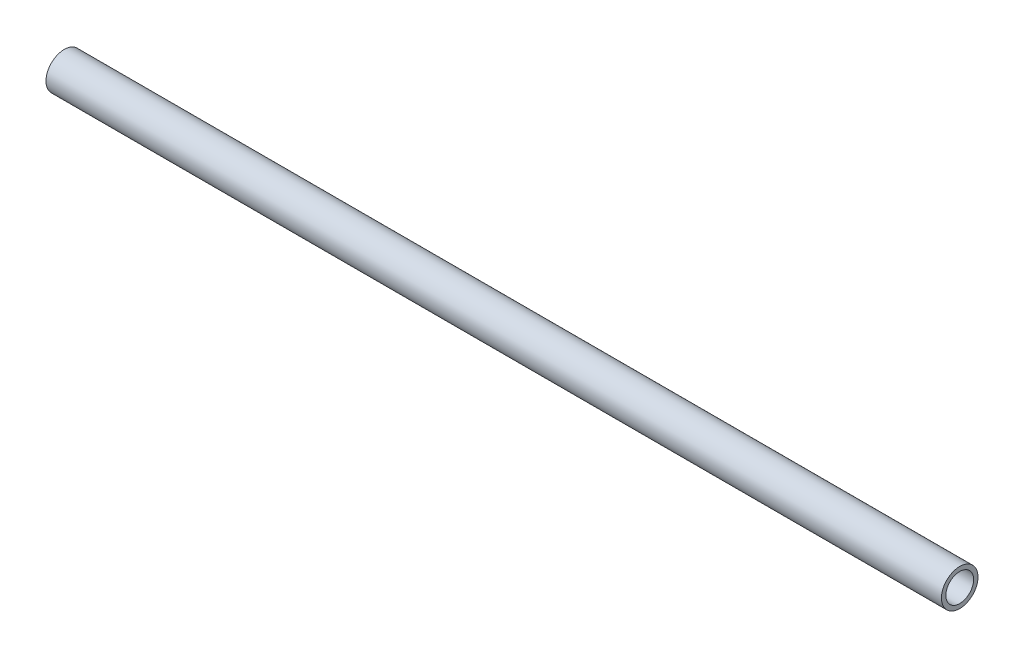
ISO-10303-21;
HEADER;
FILE_DESCRIPTION(('STEP AP214'),'2;1');
FILE_NAME('part.step','',(''),(''),'','','');
FILE_SCHEMA(('AUTOMOTIVE_DESIGN { 1 0 10303 214 1 1 1 1 }'));
ENDSEC;
DATA;
#1=APPLICATION_CONTEXT('core data for automotive mechanical design processes');
#2=APPLICATION_PROTOCOL_DEFINITION('international standard','automotive_design',2000,#1);
#3=PRODUCT_CONTEXT('',#1,'mechanical');
#4=PRODUCT('Part','Part','',(#3));
#5=PRODUCT_RELATED_PRODUCT_CATEGORY('part','',(#4));
#6=PRODUCT_DEFINITION_FORMATION('','',#4);
#7=PRODUCT_DEFINITION_CONTEXT('part definition',#1,'design');
#8=PRODUCT_DEFINITION('design','',#6,#7);
#9=PRODUCT_DEFINITION_SHAPE('','',#8);
#10=(LENGTH_UNIT() NAMED_UNIT(*) SI_UNIT(.MILLI.,.METRE.));
#11=(NAMED_UNIT(*) PLANE_ANGLE_UNIT() SI_UNIT($,.RADIAN.));
#12=(NAMED_UNIT(*) SI_UNIT($,.STERADIAN.) SOLID_ANGLE_UNIT());
#13=UNCERTAINTY_MEASURE_WITH_UNIT(LENGTH_MEASURE(1.E-05),#10,'distance_accuracy_value','');
#14=(GEOMETRIC_REPRESENTATION_CONTEXT(3) GLOBAL_UNCERTAINTY_ASSIGNED_CONTEXT((#13)) GLOBAL_UNIT_ASSIGNED_CONTEXT((#10,
#11,#12)) REPRESENTATION_CONTEXT('',''));
#15=CARTESIAN_POINT('',(0.,0.,0.));
#16=DIRECTION('',(0.,0.,1.));
#17=DIRECTION('',(1.,0.,0.));
#18=AXIS2_PLACEMENT_3D('',#15,#16,#17);
#19=CARTESIAN_POINT('',(622.3,0.,0.));
#20=DIRECTION('',(1.,0.,0.));
#21=DIRECTION('',(0.,0.,-1.));
#22=AXIS2_PLACEMENT_3D('',#19,#20,#21);
#23=PLANE('',#22);
#24=CARTESIAN_POINT('',(622.3,0.,0.));
#25=DIRECTION('',(1.,0.,0.));
#26=DIRECTION('',(0.,0.,-1.));
#27=AXIS2_PLACEMENT_3D('',#24,#25,#26);
#28=CIRCLE('',#27,12.7);
#29=CARTESIAN_POINT('',(622.3,0.,-12.7));
#30=VERTEX_POINT('',#29);
#31=EDGE_CURVE('E10',#30,#30,#28,.T.);
#32=ORIENTED_EDGE('',*,*,#31,.T.);
#33=EDGE_LOOP('',(#32));
#34=FACE_BOUND('',#33,.T.);
#35=CARTESIAN_POINT('',(622.3,0.,0.));
#36=DIRECTION('',(1.,0.,0.));
#37=DIRECTION('',(0.,0.,-1.));
#38=AXIS2_PLACEMENT_3D('',#35,#36,#37);
#39=CIRCLE('',#38,9.652);
#40=CARTESIAN_POINT('',(622.3,0.,-9.652));
#41=VERTEX_POINT('',#40);
#42=EDGE_CURVE('E49',#41,#41,#39,.T.);
#43=ORIENTED_EDGE('',*,*,#42,.F.);
#44=EDGE_LOOP('',(#43));
#45=FACE_BOUND('',#44,.T.);
#46=ADVANCED_FACE('F34',(#34,#45),#23,.T.);
#47=CARTESIAN_POINT('',(0.,0.,0.));
#48=DIRECTION('',(1.,0.,0.));
#49=DIRECTION('',(0.,0.,-1.));
#50=AXIS2_PLACEMENT_3D('',#47,#48,#49);
#51=PLANE('',#50);
#52=CARTESIAN_POINT('',(0.,0.,0.));
#53=DIRECTION('',(1.,0.,0.));
#54=DIRECTION('',(0.,0.,-1.));
#55=AXIS2_PLACEMENT_3D('',#52,#53,#54);
#56=CIRCLE('',#55,12.7);
#57=CARTESIAN_POINT('',(0.,0.,-12.7));
#58=VERTEX_POINT('',#57);
#59=EDGE_CURVE('E38',#58,#58,#56,.T.);
#60=ORIENTED_EDGE('',*,*,#59,.F.);
#61=EDGE_LOOP('',(#60));
#62=FACE_BOUND('',#61,.T.);
#63=CARTESIAN_POINT('',(0.,0.,0.));
#64=DIRECTION('',(1.,0.,0.));
#65=DIRECTION('',(0.,0.,-1.));
#66=AXIS2_PLACEMENT_3D('',#63,#64,#65);
#67=CIRCLE('',#66,9.652);
#68=CARTESIAN_POINT('',(0.,0.,-9.652));
#69=VERTEX_POINT('',#68);
#70=EDGE_CURVE('E51',#69,#69,#67,.T.);
#71=ORIENTED_EDGE('',*,*,#70,.T.);
#72=EDGE_LOOP('',(#71));
#73=FACE_BOUND('',#72,.T.);
#74=ADVANCED_FACE('F61',(#62,#73),#51,.F.);
#75=CARTESIAN_POINT('',(622.3,0.,0.));
#76=DIRECTION('',(-1.,0.,0.));
#77=DIRECTION('',(0.,0.,1.));
#78=AXIS2_PLACEMENT_3D('',#75,#76,#77);
#79=CYLINDRICAL_SURFACE('',#78,12.7);
#80=ORIENTED_EDGE('',*,*,#31,.F.);
#81=EDGE_LOOP('',(#80));
#82=FACE_BOUND('',#81,.T.);
#83=ORIENTED_EDGE('',*,*,#59,.T.);
#84=EDGE_LOOP('',(#83));
#85=FACE_BOUND('',#84,.T.);
#86=ADVANCED_FACE('F36',(#82,#85),#79,.T.);
#87=CARTESIAN_POINT('',(622.3,0.,0.));
#88=DIRECTION('',(-1.,0.,0.));
#89=DIRECTION('',(0.,0.,1.));
#90=AXIS2_PLACEMENT_3D('',#87,#88,#89);
#91=CYLINDRICAL_SURFACE('',#90,9.652);
#92=ORIENTED_EDGE('',*,*,#42,.T.);
#93=EDGE_LOOP('',(#92));
#94=FACE_BOUND('',#93,.T.);
#95=ORIENTED_EDGE('',*,*,#70,.F.);
#96=EDGE_LOOP('',(#95));
#97=FACE_BOUND('',#96,.T.);
#98=ADVANCED_FACE('F57',(#94,#97),#91,.F.);
#99=CLOSED_SHELL('',(#46,#74,#86,#98));
#100=MANIFOLD_SOLID_BREP('B2',#99);
#101=ADVANCED_BREP_SHAPE_REPRESENTATION('',(#18,#100),#14);
#102=SHAPE_DEFINITION_REPRESENTATION(#9,#101);
ENDSEC;
END-ISO-10303-21;
